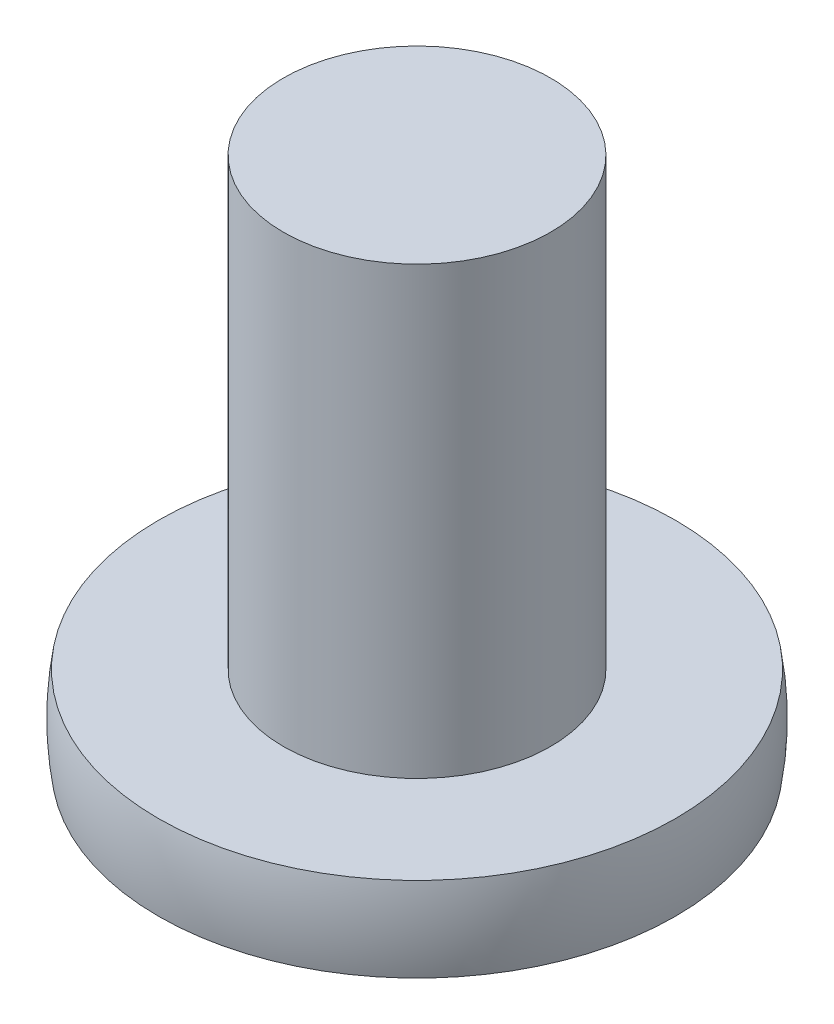
ISO-10303-21;
HEADER;
FILE_DESCRIPTION(('STEP AP214'),'2;1');
FILE_NAME('part.step','',(''),(''),'','','');
FILE_SCHEMA(('AUTOMOTIVE_DESIGN { 1 0 10303 214 1 1 1 1 }'));
ENDSEC;
DATA;
#1=APPLICATION_CONTEXT('core data for automotive mechanical design processes');
#2=APPLICATION_PROTOCOL_DEFINITION('international standard','automotive_design',2000,#1);
#3=PRODUCT_CONTEXT('',#1,'mechanical');
#4=PRODUCT('Part','Part','',(#3));
#5=PRODUCT_RELATED_PRODUCT_CATEGORY('part','',(#4));
#6=PRODUCT_DEFINITION_FORMATION('','',#4);
#7=PRODUCT_DEFINITION_CONTEXT('part definition',#1,'design');
#8=PRODUCT_DEFINITION('design','',#6,#7);
#9=PRODUCT_DEFINITION_SHAPE('','',#8);
#10=(LENGTH_UNIT() NAMED_UNIT(*) SI_UNIT(.MILLI.,.METRE.));
#11=(NAMED_UNIT(*) PLANE_ANGLE_UNIT() SI_UNIT($,.RADIAN.));
#12=(NAMED_UNIT(*) SI_UNIT($,.STERADIAN.) SOLID_ANGLE_UNIT());
#13=UNCERTAINTY_MEASURE_WITH_UNIT(LENGTH_MEASURE(1.E-05),#10,'distance_accuracy_value','');
#14=(GEOMETRIC_REPRESENTATION_CONTEXT(3) GLOBAL_UNCERTAINTY_ASSIGNED_CONTEXT((#13)) GLOBAL_UNIT_ASSIGNED_CONTEXT((#10,
#11,#12)) REPRESENTATION_CONTEXT('',''));
#15=CARTESIAN_POINT('',(0.,0.,0.));
#16=DIRECTION('',(0.,0.,1.));
#17=DIRECTION('',(1.,0.,0.));
#18=AXIS2_PLACEMENT_3D('',#15,#16,#17);
#19=CARTESIAN_POINT('',(0.,2.,0.));
#20=DIRECTION('',(0.,-1.,0.));
#21=DIRECTION('',(0.,0.,-1.));
#22=AXIS2_PLACEMENT_3D('',#19,#20,#21);
#23=CYLINDRICAL_SURFACE('',#22,1.5);
#24=CARTESIAN_POINT('',(0.,0.,0.));
#25=DIRECTION('',(0.,1.,0.));
#26=DIRECTION('',(0.,0.,1.));
#27=AXIS2_PLACEMENT_3D('',#24,#25,#26);
#28=CIRCLE('',#27,1.5);
#29=CARTESIAN_POINT('',(0.,0.,1.5));
#30=VERTEX_POINT('',#29);
#31=EDGE_CURVE('E11',#30,#30,#28,.T.);
#32=ORIENTED_EDGE('',*,*,#31,.T.);
#33=EDGE_LOOP('',(#32));
#34=FACE_BOUND('',#33,.T.);
#35=CARTESIAN_POINT('',(0.,5.,0.));
#36=DIRECTION('',(0.,1.,0.));
#37=DIRECTION('',(0.,0.,1.));
#38=AXIS2_PLACEMENT_3D('',#35,#36,#37);
#39=CIRCLE('',#38,1.5);
#40=CARTESIAN_POINT('',(0.,5.,1.5));
#41=VERTEX_POINT('',#40);
#42=EDGE_CURVE('E160',#41,#41,#39,.T.);
#43=ORIENTED_EDGE('',*,*,#42,.F.);
#44=EDGE_LOOP('',(#43));
#45=FACE_BOUND('',#44,.T.);
#46=ADVANCED_FACE('F35',(#34,#45),#23,.T.);
#47=CARTESIAN_POINT('',(0.,0.,0.));
#48=DIRECTION('',(0.,1.,0.));
#49=DIRECTION('',(0.,0.,1.));
#50=AXIS2_PLACEMENT_3D('',#47,#48,#49);
#51=PLANE('',#50);
#52=CARTESIAN_POINT('',(0.,0.,0.));
#53=DIRECTION('',(0.,1.,0.));
#54=DIRECTION('',(0.,0.,1.));
#55=AXIS2_PLACEMENT_3D('',#52,#53,#54);
#56=CIRCLE('',#55,2.90137467418464);
#57=CARTESIAN_POINT('',(0.,0.,2.90137467418464));
#58=VERTEX_POINT('',#57);
#59=EDGE_CURVE('E42',#58,#58,#56,.T.);
#60=ORIENTED_EDGE('',*,*,#59,.T.);
#61=EDGE_LOOP('',(#60));
#62=FACE_BOUND('',#61,.T.);
#63=ORIENTED_EDGE('',*,*,#31,.F.);
#64=EDGE_LOOP('',(#63));
#65=FACE_BOUND('',#64,.T.);
#66=ADVANCED_FACE('F213',(#62,#65),#51,.T.);
#67=CARTESIAN_POINT('',(0.,-0.475,0.));
#68=DIRECTION('',(0.,1.,0.));
#69=DIRECTION('',(0.,0.,1.));
#70=AXIS2_PLACEMENT_3D('',#67,#68,#69);
#71=SPHERICAL_SURFACE('',#70,2.94);
#72=CARTESIAN_POINT('',(0.,-0.95,0.));
#73=DIRECTION('',(0.,1.,0.));
#74=DIRECTION('',(0.,0.,1.));
#75=AXIS2_PLACEMENT_3D('',#72,#73,#74);
#76=CIRCLE('',#75,2.90137467418464);
#77=CARTESIAN_POINT('',(0.,-0.95,2.90137467418464));
#78=VERTEX_POINT('',#77);
#79=EDGE_CURVE('E191',#78,#78,#76,.T.);
#80=CARTESIAN_POINT('',(0.,0.,2.90137467418464));
#81=CARTESIAN_POINT('',(0.,-0.00980881629928072,2.90298053131762));
#82=CARTESIAN_POINT('',(0.,-0.0196257766451737,2.90453664313114));
#83=CARTESIAN_POINT('',(0.,-0.0392749743767388,2.90754922413465));
#84=CARTESIAN_POINT('',(0.,-0.0491072117624109,2.90900569332463));
#85=CARTESIAN_POINT('',(0.,-0.0687859525200891,2.91181883709648));
#86=CARTESIAN_POINT('',(0.,-0.078632455892095,2.91317551167835));
#87=CARTESIAN_POINT('',(0.,-0.0983387156804639,2.91578892726105));
#88=CARTESIAN_POINT('',(0.,-0.108198472096827,2.91704566826189));
#89=CARTESIAN_POINT('',(0.,-0.127930223781495,2.91945908725332));
#90=CARTESIAN_POINT('',(0.,-0.137802219049799,2.92061576524392));
#91=CARTESIAN_POINT('',(0.,-0.157557432956763,2.92282893927576));
#92=CARTESIAN_POINT('',(0.,-0.167440651595423,2.923885435317));
#93=CARTESIAN_POINT('',(0.,-0.187217295615127,2.9258981367633));
#94=CARTESIAN_POINT('',(0.,-0.197110720996172,2.92685434216836));
#95=CARTESIAN_POINT('',(0.,-0.216906760820597,2.92866636398596));
#96=CARTESIAN_POINT('',(0.,-0.226809375263978,2.9295221803985));
#97=CARTESIAN_POINT('',(0.,-0.246622774588383,2.93113333619737));
#98=CARTESIAN_POINT('',(0.,-0.256533559469406,2.9318886755837));
#99=CARTESIAN_POINT('',(0.,-0.276362280203802,2.93329879963294));
#100=CARTESIAN_POINT('',(0.,-0.286280216057174,2.93395358429586));
#101=CARTESIAN_POINT('',(0.,-0.306122218535434,2.93516253154431));
#102=CARTESIAN_POINT('',(0.,-0.316046285160321,2.93571669412984));
#103=CARTESIAN_POINT('',(0.,-0.335899528350132,2.93672434022002));
#104=CARTESIAN_POINT('',(0.,-0.345828704915055,2.93717782372468));
#105=CARTESIAN_POINT('',(0.,-0.365691146627828,2.93798406500587));
#106=CARTESIAN_POINT('',(0.,-0.375624411775678,2.93833682278241));
#107=CARTESIAN_POINT('',(0.,-0.395494008876629,2.93894157632122));
#108=CARTESIAN_POINT('',(0.,-0.40543034082973,2.93919357208349));
#109=CARTESIAN_POINT('',(0.,-0.425305049448039,2.9395967756724));
#110=CARTESIAN_POINT('',(0.,-0.435243426113248,2.93974798349905));
#111=CARTESIAN_POINT('',(0.,-0.455121201852305,2.93994959566285));
#112=CARTESIAN_POINT('',(0.,-0.465060600926153,2.94));
#113=CARTESIAN_POINT('',(0.,-0.484939399073848,2.94));
#114=CARTESIAN_POINT('',(0.,-0.494878798147696,2.93994959566285));
#115=CARTESIAN_POINT('',(0.,-0.514756573886752,2.93974798349905));
#116=CARTESIAN_POINT('',(0.,-0.524694950551961,2.9395967756724));
#117=CARTESIAN_POINT('',(0.,-0.544569659170271,2.93919357208349));
#118=CARTESIAN_POINT('',(0.,-0.554505991123371,2.93894157632122));
#119=CARTESIAN_POINT('',(0.,-0.574375588224322,2.93833682278241));
#120=CARTESIAN_POINT('',(0.,-0.584308853372173,2.93798406500587));
#121=CARTESIAN_POINT('',(0.,-0.604171295084946,2.93717782372468));
#122=CARTESIAN_POINT('',(0.,-0.614100471649869,2.93672434022002));
#123=CARTESIAN_POINT('',(0.,-0.633953714839679,2.93571669412984));
#124=CARTESIAN_POINT('',(0.,-0.643877781464567,2.93516253154431));
#125=CARTESIAN_POINT('',(0.,-0.663719783942826,2.93395358429586));
#126=CARTESIAN_POINT('',(0.,-0.673637719796198,2.93329879963294));
#127=CARTESIAN_POINT('',(0.,-0.693466440530594,2.9318886755837));
#128=CARTESIAN_POINT('',(0.,-0.703377225411618,2.93113333619737));
#129=CARTESIAN_POINT('',(0.,-0.723190624736022,2.9295221803985));
#130=CARTESIAN_POINT('',(0.,-0.733093239179403,2.92866636398596));
#131=CARTESIAN_POINT('',(0.,-0.752889279003829,2.92685434216836));
#132=CARTESIAN_POINT('',(0.,-0.762782704384873,2.9258981367633));
#133=CARTESIAN_POINT('',(0.,-0.782559348404578,2.923885435317));
#134=CARTESIAN_POINT('',(0.,-0.792442567043237,2.92282893927576));
#135=CARTESIAN_POINT('',(0.,-0.812197780950201,2.92061576524392));
#136=CARTESIAN_POINT('',(0.,-0.822069776218506,2.91945908725332));
#137=CARTESIAN_POINT('',(0.,-0.841801527903174,2.91704566826189));
#138=CARTESIAN_POINT('',(0.,-0.851661284319537,2.91578892726105));
#139=CARTESIAN_POINT('',(0.,-0.871367544107906,2.91317551167835));
#140=CARTESIAN_POINT('',(0.,-0.881214047479911,2.91181883709648));
#141=CARTESIAN_POINT('',(0.,-0.900892788237589,2.90900569332463));
#142=CARTESIAN_POINT('',(0.,-0.910725025623262,2.90754922413465));
#143=CARTESIAN_POINT('',(0.,-0.930374223354827,2.90453664313114));
#144=CARTESIAN_POINT('',(0.,-0.94019118370072,2.90298053131762));
#145=CARTESIAN_POINT('',(0.,-0.95,2.90137467418464));
#146=B_SPLINE_CURVE_WITH_KNOTS('',3,(#80,#81,#82,#83,#84,#85,#86,#87,#88,#89,#90,#91,#92,#93,
#94,#95,#96,#97,#98,#99,#100,#101,#102,#103,#104,#105,#106,#107,#108,#109,#110,#111,#112,#113,
#114,#115,#116,#117,#118,#119,#120,#121,#122,#123,#124,#125,#126,#127,#128,#129,#130,#131,#132,
#133,#134,#135,#136,#137,#138,#139,#140,#141,#142,#143,#144,#145),.UNSPECIFIED.,.F.,.F.,(4,2,2,
2,2,2,2,2,2,2,2,2,2,2,2,2,2,2,2,2,2,2,2,2,2,2,2,2,2,2,2,2,4),(0.,0.029818069421285,
0.05963613884257,0.0894542082638548,0.11927227768514,0.149090347106425,0.17890841652771,
0.208726485948995,0.23854455537028,0.268362624791564,0.298180694212849,0.327998763634134,
0.357816833055419,0.387634902476704,0.417452971897989,0.447271041319274,0.477089110740559,
0.506907180161844,0.536725249583129,0.566543319004414,0.596361388425699,0.626179457846984,
0.655997527268269,0.685815596689554,0.715633666110839,0.745451735532124,0.775269804953408,
0.805087874374693,0.834905943795978,0.864724013217263,0.894542082638548,0.924360152059833,
0.954178221481118),.UNSPECIFIED.);
#147=EDGE_CURVE('BSEAM216',#58,#78,#146,.T.);
#148=ORIENTED_EDGE('',*,*,#59,.F.);
#149=ORIENTED_EDGE('',*,*,#79,.T.);
#150=ORIENTED_EDGE('',*,*,#147,.T.);
#151=ORIENTED_EDGE('',*,*,#147,.F.);
#152=EDGE_LOOP('',(#148,#150,#149,#151));
#153=FACE_BOUND('',#152,.T.);
#154=ADVANCED_FACE('F216',(#153),#71,.T.);
#155=CARTESIAN_POINT('',(0.,-0.95,0.));
#156=DIRECTION('',(0.,1.,0.));
#157=DIRECTION('',(0.,0.,1.));
#158=AXIS2_PLACEMENT_3D('',#155,#156,#157);
#159=PLANE('',#158);
#160=DIRECTION('',(0.,0.,1.));
#161=VECTOR('',#160,1.);
#162=CARTESIAN_POINT('',(0.400000000000001,-0.95,0.4));
#163=LINE('',#162,#161);
#164=CARTESIAN_POINT('',(0.400000000000001,-0.95,0.4));
#165=VERTEX_POINT('',#164);
#166=CARTESIAN_POINT('',(0.400000000000001,-0.95,1.5));
#167=VERTEX_POINT('',#166);
#168=EDGE_CURVE('E159',#165,#167,#163,.T.);
#169=ORIENTED_EDGE('',*,*,#168,.F.);
#170=DIRECTION('',(-1.,0.,0.));
#171=VECTOR('',#170,1.);
#172=CARTESIAN_POINT('',(1.5,-0.95,0.4));
#173=LINE('',#172,#171);
#174=CARTESIAN_POINT('',(1.5,-0.95,0.4));
#175=VERTEX_POINT('',#174);
#176=EDGE_CURVE('E49',#175,#165,#173,.T.);
#177=ORIENTED_EDGE('',*,*,#176,.F.);
#178=DIRECTION('',(0.,0.,1.));
#179=VECTOR('',#178,1.);
#180=CARTESIAN_POINT('',(1.5,-0.95,-0.4));
#181=LINE('',#180,#179);
#182=CARTESIAN_POINT('',(1.5,-0.95,-0.4));
#183=VERTEX_POINT('',#182);
#184=EDGE_CURVE('E187',#183,#175,#181,.T.);
#185=ORIENTED_EDGE('',*,*,#184,.F.);
#186=DIRECTION('',(1.,0.,0.));
#187=VECTOR('',#186,1.);
#188=CARTESIAN_POINT('',(1.5,-0.95,-0.4));
#189=LINE('',#188,#187);
#190=CARTESIAN_POINT('',(0.400000000000001,-0.95,-0.4));
#191=VERTEX_POINT('',#190);
#192=EDGE_CURVE('E185',#191,#183,#189,.T.);
#193=ORIENTED_EDGE('',*,*,#192,.F.);
#194=DIRECTION('',(0.,0.,1.));
#195=VECTOR('',#194,1.);
#196=CARTESIAN_POINT('',(0.400000000000001,-0.95,-0.4));
#197=LINE('',#196,#195);
#198=CARTESIAN_POINT('',(0.400000000000001,-0.95,-1.5));
#199=VERTEX_POINT('',#198);
#200=EDGE_CURVE('E133',#199,#191,#197,.T.);
#201=ORIENTED_EDGE('',*,*,#200,.F.);
#202=DIRECTION('',(1.,0.,0.));
#203=VECTOR('',#202,1.);
#204=CARTESIAN_POINT('',(0.400000000000001,-0.95,-1.5));
#205=LINE('',#204,#203);
#206=CARTESIAN_POINT('',(-0.4,-0.95,-1.5));
#207=VERTEX_POINT('',#206);
#208=EDGE_CURVE('E181',#207,#199,#205,.T.);
#209=ORIENTED_EDGE('',*,*,#208,.F.);
#210=DIRECTION('',(0.,0.,-1.));
#211=VECTOR('',#210,1.);
#212=CARTESIAN_POINT('',(-0.4,-0.95,-0.4));
#213=LINE('',#212,#211);
#214=CARTESIAN_POINT('',(-0.4,-0.95,-0.4));
#215=VERTEX_POINT('',#214);
#216=EDGE_CURVE('E178',#215,#207,#213,.T.);
#217=ORIENTED_EDGE('',*,*,#216,.F.);
#218=DIRECTION('',(1.,0.,0.));
#219=VECTOR('',#218,1.);
#220=CARTESIAN_POINT('',(-1.5,-0.95,-0.399999999999999));
#221=LINE('',#220,#219);
#222=CARTESIAN_POINT('',(-1.5,-0.95,-0.399999999999999));
#223=VERTEX_POINT('',#222);
#224=EDGE_CURVE('E175',#223,#215,#221,.T.);
#225=ORIENTED_EDGE('',*,*,#224,.F.);
#226=DIRECTION('',(0.,0.,-1.));
#227=VECTOR('',#226,1.);
#228=CARTESIAN_POINT('',(-1.5,-0.95,-0.399999999999999));
#229=LINE('',#228,#227);
#230=CARTESIAN_POINT('',(-1.5,-0.95,0.399999999999999));
#231=VERTEX_POINT('',#230);
#232=EDGE_CURVE('E172',#231,#223,#229,.T.);
#233=ORIENTED_EDGE('',*,*,#232,.F.);
#234=DIRECTION('',(-1.,0.,0.));
#235=VECTOR('',#234,1.);
#236=CARTESIAN_POINT('',(-1.5,-0.95,0.399999999999999));
#237=LINE('',#236,#235);
#238=CARTESIAN_POINT('',(-0.4,-0.95,0.4));
#239=VERTEX_POINT('',#238);
#240=EDGE_CURVE('E169',#239,#231,#237,.T.);
#241=ORIENTED_EDGE('',*,*,#240,.F.);
#242=DIRECTION('',(0.,0.,-1.));
#243=VECTOR('',#242,1.);
#244=CARTESIAN_POINT('',(-0.4,-0.95,0.4));
#245=LINE('',#244,#243);
#246=CARTESIAN_POINT('',(-0.4,-0.95,1.5));
#247=VERTEX_POINT('',#246);
#248=EDGE_CURVE('E166',#247,#239,#245,.T.);
#249=ORIENTED_EDGE('',*,*,#248,.F.);
#250=DIRECTION('',(-1.,0.,0.));
#251=VECTOR('',#250,1.);
#252=CARTESIAN_POINT('',(0.400000000000001,-0.95,1.5));
#253=LINE('',#252,#251);
#254=EDGE_CURVE('E163',#167,#247,#253,.T.);
#255=ORIENTED_EDGE('',*,*,#254,.F.);
#256=EDGE_LOOP('',(#169,#177,#185,#193,#201,#209,#217,#225,#233,#241,#249,#255));
#257=FACE_BOUND('',#256,.T.);
#258=ORIENTED_EDGE('',*,*,#79,.F.);
#259=EDGE_LOOP('',(#258));
#260=FACE_BOUND('',#259,.T.);
#261=ADVANCED_FACE('F219',(#257,#260),#159,.F.);
#262=CARTESIAN_POINT('',(1.5,-0.35,0.4));
#263=DIRECTION('',(0.,0.,1.));
#264=DIRECTION('',(1.,0.,0.));
#265=AXIS2_PLACEMENT_3D('',#262,#263,#264);
#266=PLANE('',#265);
#267=ORIENTED_EDGE('',*,*,#176,.T.);
#268=DIRECTION('',(0.,-1.,0.));
#269=VECTOR('',#268,1.);
#270=CARTESIAN_POINT('',(0.400000000000001,-0.35,0.4));
#271=LINE('',#270,#269);
#272=CARTESIAN_POINT('',(0.400000000000001,-0.35,0.4));
#273=VERTEX_POINT('',#272);
#274=EDGE_CURVE('E97',#273,#165,#271,.T.);
#275=ORIENTED_EDGE('',*,*,#274,.F.);
#276=DIRECTION('',(-1.,0.,0.));
#277=VECTOR('',#276,1.);
#278=CARTESIAN_POINT('',(1.5,-0.35,0.4));
#279=LINE('',#278,#277);
#280=CARTESIAN_POINT('',(1.5,-0.35,0.4));
#281=VERTEX_POINT('',#280);
#282=EDGE_CURVE('E189',#281,#273,#279,.T.);
#283=ORIENTED_EDGE('',*,*,#282,.F.);
#284=DIRECTION('',(0.,-1.,0.));
#285=VECTOR('',#284,1.);
#286=CARTESIAN_POINT('',(1.5,-0.35,0.4));
#287=LINE('',#286,#285);
#288=EDGE_CURVE('E57',#281,#175,#287,.T.);
#289=ORIENTED_EDGE('',*,*,#288,.T.);
#290=EDGE_LOOP('',(#267,#275,#283,#289));
#291=FACE_BOUND('',#290,.T.);
#292=ADVANCED_FACE('F224',(#291),#266,.F.);
#293=CARTESIAN_POINT('',(1.5,-0.35,-0.4));
#294=DIRECTION('',(1.,0.,0.));
#295=DIRECTION('',(0.,0.,-1.));
#296=AXIS2_PLACEMENT_3D('',#293,#294,#295);
#297=PLANE('',#296);
#298=ORIENTED_EDGE('',*,*,#184,.T.);
#299=ORIENTED_EDGE('',*,*,#288,.F.);
#300=DIRECTION('',(0.,0.,1.));
#301=VECTOR('',#300,1.);
#302=CARTESIAN_POINT('',(1.5,-0.35,-0.4));
#303=LINE('',#302,#301);
#304=CARTESIAN_POINT('',(1.5,-0.35,-0.4));
#305=VERTEX_POINT('',#304);
#306=EDGE_CURVE('E145',#305,#281,#303,.T.);
#307=ORIENTED_EDGE('',*,*,#306,.F.);
#308=DIRECTION('',(0.,-1.,0.));
#309=VECTOR('',#308,1.);
#310=CARTESIAN_POINT('',(1.5,-0.35,-0.4));
#311=LINE('',#310,#309);
#312=EDGE_CURVE('E137',#305,#183,#311,.T.);
#313=ORIENTED_EDGE('',*,*,#312,.T.);
#314=EDGE_LOOP('',(#298,#299,#307,#313));
#315=FACE_BOUND('',#314,.T.);
#316=ADVANCED_FACE('F230',(#315),#297,.F.);
#317=CARTESIAN_POINT('',(1.5,-0.35,-0.4));
#318=DIRECTION('',(0.,0.,-1.));
#319=DIRECTION('',(-1.,0.,0.));
#320=AXIS2_PLACEMENT_3D('',#317,#318,#319);
#321=PLANE('',#320);
#322=ORIENTED_EDGE('',*,*,#192,.T.);
#323=ORIENTED_EDGE('',*,*,#312,.F.);
#324=DIRECTION('',(1.,0.,0.));
#325=VECTOR('',#324,1.);
#326=CARTESIAN_POINT('',(1.5,-0.35,-0.4));
#327=LINE('',#326,#325);
#328=CARTESIAN_POINT('',(0.400000000000001,-0.35,-0.4));
#329=VERTEX_POINT('',#328);
#330=EDGE_CURVE('E141',#329,#305,#327,.T.);
#331=ORIENTED_EDGE('',*,*,#330,.F.);
#332=DIRECTION('',(0.,-1.,0.));
#333=VECTOR('',#332,1.);
#334=CARTESIAN_POINT('',(0.400000000000001,-0.35,-0.4));
#335=LINE('',#334,#333);
#336=EDGE_CURVE('E126',#329,#191,#335,.T.);
#337=ORIENTED_EDGE('',*,*,#336,.T.);
#338=EDGE_LOOP('',(#322,#323,#331,#337));
#339=FACE_BOUND('',#338,.T.);
#340=ADVANCED_FACE('F142',(#339),#321,.F.);
#341=CARTESIAN_POINT('',(0.400000000000001,-0.35,-0.4));
#342=DIRECTION('',(1.,0.,0.));
#343=DIRECTION('',(0.,0.,-1.));
#344=AXIS2_PLACEMENT_3D('',#341,#342,#343);
#345=PLANE('',#344);
#346=ORIENTED_EDGE('',*,*,#200,.T.);
#347=ORIENTED_EDGE('',*,*,#336,.F.);
#348=DIRECTION('',(0.,0.,1.));
#349=VECTOR('',#348,1.);
#350=CARTESIAN_POINT('',(0.400000000000001,-0.35,-0.4));
#351=LINE('',#350,#349);
#352=CARTESIAN_POINT('',(0.400000000000001,-0.35,-1.5));
#353=VERTEX_POINT('',#352);
#354=EDGE_CURVE('E130',#353,#329,#351,.T.);
#355=ORIENTED_EDGE('',*,*,#354,.F.);
#356=DIRECTION('',(0.,-1.,0.));
#357=VECTOR('',#356,1.);
#358=CARTESIAN_POINT('',(0.400000000000001,-0.35,-1.5));
#359=LINE('',#358,#357);
#360=EDGE_CURVE('E138',#353,#199,#359,.T.);
#361=ORIENTED_EDGE('',*,*,#360,.T.);
#362=EDGE_LOOP('',(#346,#347,#355,#361));
#363=FACE_BOUND('',#362,.T.);
#364=ADVANCED_FACE('F128',(#363),#345,.F.);
#365=CARTESIAN_POINT('',(0.400000000000001,-0.35,-1.5));
#366=DIRECTION('',(0.,0.,-1.));
#367=DIRECTION('',(-1.,0.,0.));
#368=AXIS2_PLACEMENT_3D('',#365,#366,#367);
#369=PLANE('',#368);
#370=ORIENTED_EDGE('',*,*,#208,.T.);
#371=ORIENTED_EDGE('',*,*,#360,.F.);
#372=DIRECTION('',(1.,0.,0.));
#373=VECTOR('',#372,1.);
#374=CARTESIAN_POINT('',(0.400000000000001,-0.35,-1.5));
#375=LINE('',#374,#373);
#376=CARTESIAN_POINT('',(-0.4,-0.35,-1.5));
#377=VERTEX_POINT('',#376);
#378=EDGE_CURVE('E151',#377,#353,#375,.T.);
#379=ORIENTED_EDGE('',*,*,#378,.F.);
#380=DIRECTION('',(0.,-1.,0.));
#381=VECTOR('',#380,1.);
#382=CARTESIAN_POINT('',(-0.4,-0.35,-1.5));
#383=LINE('',#382,#381);
#384=EDGE_CURVE('E194',#377,#207,#383,.T.);
#385=ORIENTED_EDGE('',*,*,#384,.T.);
#386=EDGE_LOOP('',(#370,#371,#379,#385));
#387=FACE_BOUND('',#386,.T.);
#388=ADVANCED_FACE('F270',(#387),#369,.F.);
#389=CARTESIAN_POINT('',(-0.4,-0.35,-0.4));
#390=DIRECTION('',(-1.,0.,0.));
#391=DIRECTION('',(0.,0.,1.));
#392=AXIS2_PLACEMENT_3D('',#389,#390,#391);
#393=PLANE('',#392);
#394=ORIENTED_EDGE('',*,*,#216,.T.);
#395=ORIENTED_EDGE('',*,*,#384,.F.);
#396=DIRECTION('',(0.,0.,-1.));
#397=VECTOR('',#396,1.);
#398=CARTESIAN_POINT('',(-0.4,-0.35,-0.4));
#399=LINE('',#398,#397);
#400=CARTESIAN_POINT('',(-0.4,-0.35,-0.4));
#401=VERTEX_POINT('',#400);
#402=EDGE_CURVE('E153',#401,#377,#399,.T.);
#403=ORIENTED_EDGE('',*,*,#402,.F.);
#404=DIRECTION('',(0.,-1.,0.));
#405=VECTOR('',#404,1.);
#406=CARTESIAN_POINT('',(-0.4,-0.35,-0.4));
#407=LINE('',#406,#405);
#408=EDGE_CURVE('E196',#401,#215,#407,.T.);
#409=ORIENTED_EDGE('',*,*,#408,.T.);
#410=EDGE_LOOP('',(#394,#395,#403,#409));
#411=FACE_BOUND('',#410,.T.);
#412=ADVANCED_FACE('F266',(#411),#393,.F.);
#413=CARTESIAN_POINT('',(-1.5,-0.35,-0.399999999999999));
#414=DIRECTION('',(0.,0.,-1.));
#415=DIRECTION('',(-1.,0.,0.));
#416=AXIS2_PLACEMENT_3D('',#413,#414,#415);
#417=PLANE('',#416);
#418=ORIENTED_EDGE('',*,*,#224,.T.);
#419=ORIENTED_EDGE('',*,*,#408,.F.);
#420=DIRECTION('',(1.,0.,0.));
#421=VECTOR('',#420,1.);
#422=CARTESIAN_POINT('',(-1.5,-0.35,-0.399999999999999));
#423=LINE('',#422,#421);
#424=CARTESIAN_POINT('',(-1.5,-0.35,-0.399999999999999));
#425=VERTEX_POINT('',#424);
#426=EDGE_CURVE('E261',#425,#401,#423,.T.);
#427=ORIENTED_EDGE('',*,*,#426,.F.);
#428=DIRECTION('',(0.,-1.,0.));
#429=VECTOR('',#428,1.);
#430=CARTESIAN_POINT('',(-1.5,-0.35,-0.399999999999999));
#431=LINE('',#430,#429);
#432=EDGE_CURVE('E198',#425,#223,#431,.T.);
#433=ORIENTED_EDGE('',*,*,#432,.T.);
#434=EDGE_LOOP('',(#418,#419,#427,#433));
#435=FACE_BOUND('',#434,.T.);
#436=ADVANCED_FACE('F292',(#435),#417,.F.);
#437=CARTESIAN_POINT('',(-1.5,-0.35,-0.399999999999999));
#438=DIRECTION('',(-1.,0.,0.));
#439=DIRECTION('',(0.,0.,1.));
#440=AXIS2_PLACEMENT_3D('',#437,#438,#439);
#441=PLANE('',#440);
#442=ORIENTED_EDGE('',*,*,#232,.T.);
#443=ORIENTED_EDGE('',*,*,#432,.F.);
#444=DIRECTION('',(0.,0.,-1.));
#445=VECTOR('',#444,1.);
#446=CARTESIAN_POINT('',(-1.5,-0.35,-0.399999999999999));
#447=LINE('',#446,#445);
#448=CARTESIAN_POINT('',(-1.5,-0.35,0.399999999999999));
#449=VERTEX_POINT('',#448);
#450=EDGE_CURVE('E258',#449,#425,#447,.T.);
#451=ORIENTED_EDGE('',*,*,#450,.F.);
#452=DIRECTION('',(0.,-1.,0.));
#453=VECTOR('',#452,1.);
#454=CARTESIAN_POINT('',(-1.5,-0.35,0.399999999999999));
#455=LINE('',#454,#453);
#456=EDGE_CURVE('E200',#449,#231,#455,.T.);
#457=ORIENTED_EDGE('',*,*,#456,.T.);
#458=EDGE_LOOP('',(#442,#443,#451,#457));
#459=FACE_BOUND('',#458,.T.);
#460=ADVANCED_FACE('F289',(#459),#441,.F.);
#461=CARTESIAN_POINT('',(-1.5,-0.35,0.399999999999999));
#462=DIRECTION('',(0.,0.,1.));
#463=DIRECTION('',(1.,0.,0.));
#464=AXIS2_PLACEMENT_3D('',#461,#462,#463);
#465=PLANE('',#464);
#466=ORIENTED_EDGE('',*,*,#240,.T.);
#467=ORIENTED_EDGE('',*,*,#456,.F.);
#468=DIRECTION('',(-1.,0.,0.));
#469=VECTOR('',#468,1.);
#470=CARTESIAN_POINT('',(-1.5,-0.35,0.399999999999999));
#471=LINE('',#470,#469);
#472=CARTESIAN_POINT('',(-0.4,-0.35,0.4));
#473=VERTEX_POINT('',#472);
#474=EDGE_CURVE('E255',#473,#449,#471,.T.);
#475=ORIENTED_EDGE('',*,*,#474,.F.);
#476=DIRECTION('',(0.,-1.,0.));
#477=VECTOR('',#476,1.);
#478=CARTESIAN_POINT('',(-0.4,-0.35,0.4));
#479=LINE('',#478,#477);
#480=EDGE_CURVE('E202',#473,#239,#479,.T.);
#481=ORIENTED_EDGE('',*,*,#480,.T.);
#482=EDGE_LOOP('',(#466,#467,#475,#481));
#483=FACE_BOUND('',#482,.T.);
#484=ADVANCED_FACE('F285',(#483),#465,.F.);
#485=CARTESIAN_POINT('',(-0.4,-0.35,0.4));
#486=DIRECTION('',(-1.,0.,0.));
#487=DIRECTION('',(0.,0.,1.));
#488=AXIS2_PLACEMENT_3D('',#485,#486,#487);
#489=PLANE('',#488);
#490=ORIENTED_EDGE('',*,*,#248,.T.);
#491=ORIENTED_EDGE('',*,*,#480,.F.);
#492=DIRECTION('',(0.,0.,-1.));
#493=VECTOR('',#492,1.);
#494=CARTESIAN_POINT('',(-0.4,-0.35,0.4));
#495=LINE('',#494,#493);
#496=CARTESIAN_POINT('',(-0.4,-0.35,1.5));
#497=VERTEX_POINT('',#496);
#498=EDGE_CURVE('E252',#497,#473,#495,.T.);
#499=ORIENTED_EDGE('',*,*,#498,.F.);
#500=DIRECTION('',(0.,-1.,0.));
#501=VECTOR('',#500,1.);
#502=CARTESIAN_POINT('',(-0.4,-0.35,1.5));
#503=LINE('',#502,#501);
#504=EDGE_CURVE('E204',#497,#247,#503,.T.);
#505=ORIENTED_EDGE('',*,*,#504,.T.);
#506=EDGE_LOOP('',(#490,#491,#499,#505));
#507=FACE_BOUND('',#506,.T.);
#508=ADVANCED_FACE('F281',(#507),#489,.F.);
#509=CARTESIAN_POINT('',(0.400000000000001,-0.35,1.5));
#510=DIRECTION('',(0.,0.,1.));
#511=DIRECTION('',(1.,0.,0.));
#512=AXIS2_PLACEMENT_3D('',#509,#510,#511);
#513=PLANE('',#512);
#514=ORIENTED_EDGE('',*,*,#254,.T.);
#515=ORIENTED_EDGE('',*,*,#504,.F.);
#516=DIRECTION('',(-1.,0.,0.));
#517=VECTOR('',#516,1.);
#518=CARTESIAN_POINT('',(0.400000000000001,-0.35,1.5));
#519=LINE('',#518,#517);
#520=CARTESIAN_POINT('',(0.400000000000001,-0.35,1.5));
#521=VERTEX_POINT('',#520);
#522=EDGE_CURVE('E249',#521,#497,#519,.T.);
#523=ORIENTED_EDGE('',*,*,#522,.F.);
#524=DIRECTION('',(0.,-1.,0.));
#525=VECTOR('',#524,1.);
#526=CARTESIAN_POINT('',(0.400000000000001,-0.35,1.5));
#527=LINE('',#526,#525);
#528=EDGE_CURVE('E206',#521,#167,#527,.T.);
#529=ORIENTED_EDGE('',*,*,#528,.T.);
#530=EDGE_LOOP('',(#514,#515,#523,#529));
#531=FACE_BOUND('',#530,.T.);
#532=ADVANCED_FACE('F277',(#531),#513,.F.);
#533=CARTESIAN_POINT('',(0.400000000000001,-0.35,0.4));
#534=DIRECTION('',(1.,0.,0.));
#535=DIRECTION('',(0.,0.,-1.));
#536=AXIS2_PLACEMENT_3D('',#533,#534,#535);
#537=PLANE('',#536);
#538=ORIENTED_EDGE('',*,*,#168,.T.);
#539=ORIENTED_EDGE('',*,*,#528,.F.);
#540=DIRECTION('',(0.,0.,1.));
#541=VECTOR('',#540,1.);
#542=CARTESIAN_POINT('',(0.400000000000001,-0.35,0.4));
#543=LINE('',#542,#541);
#544=EDGE_CURVE('E246',#273,#521,#543,.T.);
#545=ORIENTED_EDGE('',*,*,#544,.F.);
#546=ORIENTED_EDGE('',*,*,#274,.T.);
#547=EDGE_LOOP('',(#538,#539,#545,#546));
#548=FACE_BOUND('',#547,.T.);
#549=ADVANCED_FACE('F274',(#548),#537,.F.);
#550=CARTESIAN_POINT('',(0.,-0.35,0.));
#551=DIRECTION('',(0.,1.,0.));
#552=DIRECTION('',(0.,0.,1.));
#553=AXIS2_PLACEMENT_3D('',#550,#551,#552);
#554=PLANE('',#553);
#555=ORIENTED_EDGE('',*,*,#282,.T.);
#556=ORIENTED_EDGE('',*,*,#544,.T.);
#557=ORIENTED_EDGE('',*,*,#522,.T.);
#558=ORIENTED_EDGE('',*,*,#498,.T.);
#559=ORIENTED_EDGE('',*,*,#474,.T.);
#560=ORIENTED_EDGE('',*,*,#450,.T.);
#561=ORIENTED_EDGE('',*,*,#426,.T.);
#562=ORIENTED_EDGE('',*,*,#402,.T.);
#563=ORIENTED_EDGE('',*,*,#378,.T.);
#564=ORIENTED_EDGE('',*,*,#354,.T.);
#565=ORIENTED_EDGE('',*,*,#330,.T.);
#566=ORIENTED_EDGE('',*,*,#306,.T.);
#567=EDGE_LOOP('',(#555,#556,#557,#558,#559,#560,#561,#562,#563,#564,#565,#566));
#568=FACE_BOUND('',#567,.T.);
#569=ADVANCED_FACE('F148',(#568),#554,.F.);
#570=CARTESIAN_POINT('',(0.,5.,0.));
#571=DIRECTION('',(0.,1.,0.));
#572=DIRECTION('',(0.,0.,1.));
#573=AXIS2_PLACEMENT_3D('',#570,#571,#572);
#574=PLANE('',#573);
#575=ORIENTED_EDGE('',*,*,#42,.T.);
#576=EDGE_LOOP('',(#575));
#577=FACE_BOUND('',#576,.T.);
#578=ADVANCED_FACE('F313',(#577),#574,.T.);
#579=CLOSED_SHELL('',(#46,#66,#154,#261,#292,#316,#340,#364,#388,#412,#436,#460,#484,#508,#532,
#549,#569,#578));
#580=MANIFOLD_SOLID_BREP('B2',#579);
#581=ADVANCED_BREP_SHAPE_REPRESENTATION('',(#18,#580),#14);
#582=SHAPE_DEFINITION_REPRESENTATION(#9,#581);
ENDSEC;
END-ISO-10303-21;
